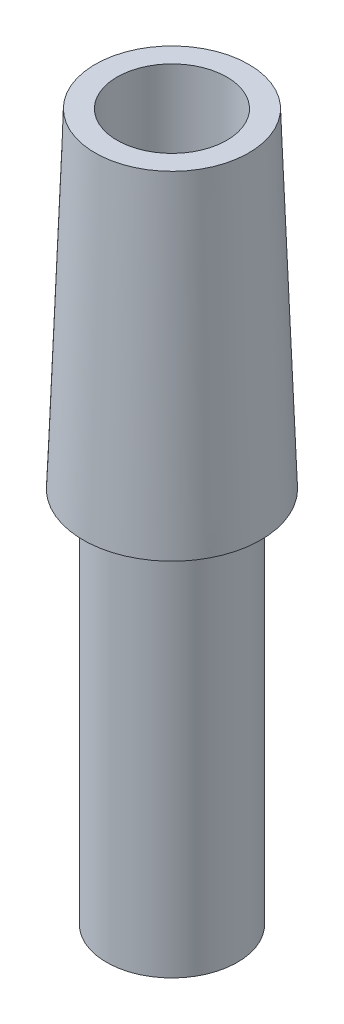
ISO-10303-21;
HEADER;
FILE_DESCRIPTION(('STEP AP214'),'2;1');
FILE_NAME('part.step','',(''),(''),'','','');
FILE_SCHEMA(('AUTOMOTIVE_DESIGN { 1 0 10303 214 1 1 1 1 }'));
ENDSEC;
DATA;
#1=APPLICATION_CONTEXT('core data for automotive mechanical design processes');
#2=APPLICATION_PROTOCOL_DEFINITION('international standard','automotive_design',2000,#1);
#3=PRODUCT_CONTEXT('',#1,'mechanical');
#4=PRODUCT('Part','Part','',(#3));
#5=PRODUCT_RELATED_PRODUCT_CATEGORY('part','',(#4));
#6=PRODUCT_DEFINITION_FORMATION('','',#4);
#7=PRODUCT_DEFINITION_CONTEXT('part definition',#1,'design');
#8=PRODUCT_DEFINITION('design','',#6,#7);
#9=PRODUCT_DEFINITION_SHAPE('','',#8);
#10=(LENGTH_UNIT() NAMED_UNIT(*) SI_UNIT(.MILLI.,.METRE.));
#11=(NAMED_UNIT(*) PLANE_ANGLE_UNIT() SI_UNIT($,.RADIAN.));
#12=(NAMED_UNIT(*) SI_UNIT($,.STERADIAN.) SOLID_ANGLE_UNIT());
#13=UNCERTAINTY_MEASURE_WITH_UNIT(LENGTH_MEASURE(1.E-05),#10,'distance_accuracy_value','');
#14=(GEOMETRIC_REPRESENTATION_CONTEXT(3) GLOBAL_UNCERTAINTY_ASSIGNED_CONTEXT((#13)) GLOBAL_UNIT_ASSIGNED_CONTEXT((#10,
#11,#12)) REPRESENTATION_CONTEXT('',''));
#15=CARTESIAN_POINT('',(0.,0.,0.));
#16=DIRECTION('',(0.,0.,1.));
#17=DIRECTION('',(1.,0.,0.));
#18=AXIS2_PLACEMENT_3D('',#15,#16,#17);
#19=CARTESIAN_POINT('',(2.985,0.,0.));
#20=DIRECTION('',(0.,-1.,0.));
#21=DIRECTION('',(0.,0.,-1.));
#22=AXIS2_PLACEMENT_3D('',#19,#20,#21);
#23=PLANE('',#22);
#24=CARTESIAN_POINT('',(0.,0.,0.));
#25=DIRECTION('',(0.,-1.,0.));
#26=DIRECTION('',(0.,0.,-1.));
#27=AXIS2_PLACEMENT_3D('',#24,#25,#26);
#28=CIRCLE('',#27,2.985);
#29=CARTESIAN_POINT('',(0.,0.,-2.985));
#30=VERTEX_POINT('',#29);
#31=EDGE_CURVE('E59',#30,#30,#28,.T.);
#32=ORIENTED_EDGE('',*,*,#31,.T.);
#33=EDGE_LOOP('',(#32));
#34=FACE_BOUND('',#33,.T.);
#35=CARTESIAN_POINT('',(0.,0.,0.));
#36=DIRECTION('',(0.,-1.,0.));
#37=DIRECTION('',(0.,0.,-1.));
#38=AXIS2_PLACEMENT_3D('',#35,#36,#37);
#39=CIRCLE('',#38,1.485);
#40=CARTESIAN_POINT('',(0.,0.,-1.485));
#41=VERTEX_POINT('',#40);
#42=EDGE_CURVE('E10',#41,#41,#39,.T.);
#43=ORIENTED_EDGE('',*,*,#42,.F.);
#44=EDGE_LOOP('',(#43));
#45=FACE_BOUND('',#44,.T.);
#46=ADVANCED_FACE('F31',(#34,#45),#23,.T.);
#47=CARTESIAN_POINT('',(0.,0.,0.));
#48=DIRECTION('',(0.,-1.,0.));
#49=DIRECTION('',(0.,0.,-1.));
#50=AXIS2_PLACEMENT_3D('',#47,#48,#49);
#51=CYLINDRICAL_SURFACE('',#50,1.485);
#52=ORIENTED_EDGE('',*,*,#42,.T.);
#53=EDGE_LOOP('',(#52));
#54=FACE_BOUND('',#53,.T.);
#55=CARTESIAN_POINT('',(0.,18.8,0.));
#56=DIRECTION('',(0.,-1.,0.));
#57=DIRECTION('',(0.,0.,-1.));
#58=AXIS2_PLACEMENT_3D('',#55,#56,#57);
#59=CIRCLE('',#58,1.485);
#60=CARTESIAN_POINT('',(0.,18.8,-1.485));
#61=VERTEX_POINT('',#60);
#62=EDGE_CURVE('E37',#61,#61,#59,.T.);
#63=ORIENTED_EDGE('',*,*,#62,.F.);
#64=EDGE_LOOP('',(#63));
#65=FACE_BOUND('',#64,.T.);
#66=ADVANCED_FACE('F77',(#54,#65),#51,.F.);
#67=CARTESIAN_POINT('',(1.485,18.8,0.));
#68=DIRECTION('',(0.,1.,0.));
#69=DIRECTION('',(0.,0.,1.));
#70=AXIS2_PLACEMENT_3D('',#67,#68,#69);
#71=PLANE('',#70);
#72=ORIENTED_EDGE('',*,*,#62,.T.);
#73=EDGE_LOOP('',(#72));
#74=FACE_BOUND('',#73,.T.);
#75=CARTESIAN_POINT('',(0.,18.8,0.));
#76=DIRECTION('',(0.,-1.,0.));
#77=DIRECTION('',(0.,0.,-1.));
#78=AXIS2_PLACEMENT_3D('',#75,#76,#77);
#79=CIRCLE('',#78,2.5);
#80=CARTESIAN_POINT('',(0.,18.8,-2.5));
#81=VERTEX_POINT('',#80);
#82=EDGE_CURVE('E41',#81,#81,#79,.T.);
#83=ORIENTED_EDGE('',*,*,#82,.F.);
#84=EDGE_LOOP('',(#83));
#85=FACE_BOUND('',#84,.T.);
#86=ADVANCED_FACE('F81',(#74,#85),#71,.T.);
#87=CARTESIAN_POINT('',(0.,0.,0.));
#88=DIRECTION('',(0.,-1.,0.));
#89=DIRECTION('',(0.,0.,-1.));
#90=AXIS2_PLACEMENT_3D('',#87,#88,#89);
#91=CYLINDRICAL_SURFACE('',#90,2.5);
#92=ORIENTED_EDGE('',*,*,#82,.T.);
#93=EDGE_LOOP('',(#92));
#94=FACE_BOUND('',#93,.T.);
#95=CARTESIAN_POINT('',(0.,32.2,0.));
#96=DIRECTION('',(0.,-1.,0.));
#97=DIRECTION('',(0.,0.,-1.));
#98=AXIS2_PLACEMENT_3D('',#95,#96,#97);
#99=CIRCLE('',#98,2.5);
#100=CARTESIAN_POINT('',(0.,32.2,-2.5));
#101=VERTEX_POINT('',#100);
#102=EDGE_CURVE('E45',#101,#101,#99,.T.);
#103=ORIENTED_EDGE('',*,*,#102,.F.);
#104=EDGE_LOOP('',(#103));
#105=FACE_BOUND('',#104,.T.);
#106=ADVANCED_FACE('F85',(#94,#105),#91,.F.);
#107=CARTESIAN_POINT('',(2.5,32.2,0.));
#108=DIRECTION('',(0.,1.,0.));
#109=DIRECTION('',(0.,0.,1.));
#110=AXIS2_PLACEMENT_3D('',#107,#108,#109);
#111=PLANE('',#110);
#112=ORIENTED_EDGE('',*,*,#102,.T.);
#113=EDGE_LOOP('',(#112));
#114=FACE_BOUND('',#113,.T.);
#115=CARTESIAN_POINT('',(0.,32.2,0.));
#116=DIRECTION('',(0.,-1.,0.));
#117=DIRECTION('',(0.,0.,-1.));
#118=AXIS2_PLACEMENT_3D('',#115,#116,#117);
#119=CIRCLE('',#118,3.5);
#120=CARTESIAN_POINT('',(0.,32.2,-3.5));
#121=VERTEX_POINT('',#120);
#122=EDGE_CURVE('E50',#121,#121,#119,.T.);
#123=ORIENTED_EDGE('',*,*,#122,.F.);
#124=EDGE_LOOP('',(#123));
#125=FACE_BOUND('',#124,.T.);
#126=ADVANCED_FACE('F91',(#114,#125),#111,.T.);
#127=CARTESIAN_POINT('',(0.,17.2,0.));
#128=DIRECTION('',(0.,-1.,0.));
#129=DIRECTION('',(0.,0.,-1.));
#130=AXIS2_PLACEMENT_3D('',#127,#128,#129);
#131=CONICAL_SURFACE('',#130,4.05,0.0366502478104116);
#132=ORIENTED_EDGE('',*,*,#122,.T.);
#133=EDGE_LOOP('',(#132));
#134=FACE_BOUND('',#133,.T.);
#135=CARTESIAN_POINT('',(0.,17.2,0.));
#136=DIRECTION('',(0.,-1.,0.));
#137=DIRECTION('',(0.,0.,-1.));
#138=AXIS2_PLACEMENT_3D('',#135,#136,#137);
#139=CIRCLE('',#138,4.05);
#140=CARTESIAN_POINT('',(0.,17.2,-4.05));
#141=VERTEX_POINT('',#140);
#142=EDGE_CURVE('E53',#141,#141,#139,.T.);
#143=ORIENTED_EDGE('',*,*,#142,.F.);
#144=EDGE_LOOP('',(#143));
#145=FACE_BOUND('',#144,.T.);
#146=ADVANCED_FACE('F73',(#134,#145),#131,.T.);
#147=CARTESIAN_POINT('',(4.05,17.2,0.));
#148=DIRECTION('',(0.,-1.,0.));
#149=DIRECTION('',(0.,0.,-1.));
#150=AXIS2_PLACEMENT_3D('',#147,#148,#149);
#151=PLANE('',#150);
#152=ORIENTED_EDGE('',*,*,#142,.T.);
#153=EDGE_LOOP('',(#152));
#154=FACE_BOUND('',#153,.T.);
#155=CARTESIAN_POINT('',(0.,17.2,0.));
#156=DIRECTION('',(0.,-1.,0.));
#157=DIRECTION('',(0.,0.,-1.));
#158=AXIS2_PLACEMENT_3D('',#155,#156,#157);
#159=CIRCLE('',#158,2.985);
#160=CARTESIAN_POINT('',(0.,17.2,-2.985));
#161=VERTEX_POINT('',#160);
#162=EDGE_CURVE('E56',#161,#161,#159,.T.);
#163=ORIENTED_EDGE('',*,*,#162,.F.);
#164=EDGE_LOOP('',(#163));
#165=FACE_BOUND('',#164,.T.);
#166=ADVANCED_FACE('F67',(#154,#165),#151,.T.);
#167=CARTESIAN_POINT('',(0.,0.,0.));
#168=DIRECTION('',(0.,-1.,0.));
#169=DIRECTION('',(0.,0.,-1.));
#170=AXIS2_PLACEMENT_3D('',#167,#168,#169);
#171=CYLINDRICAL_SURFACE('',#170,2.985);
#172=ORIENTED_EDGE('',*,*,#162,.T.);
#173=EDGE_LOOP('',(#172));
#174=FACE_BOUND('',#173,.T.);
#175=ORIENTED_EDGE('',*,*,#31,.F.);
#176=EDGE_LOOP('',(#175));
#177=FACE_BOUND('',#176,.T.);
#178=ADVANCED_FACE('F65',(#174,#177),#171,.T.);
#179=CLOSED_SHELL('',(#46,#66,#86,#106,#126,#146,#166,#178));
#180=MANIFOLD_SOLID_BREP('B2',#179);
#181=ADVANCED_BREP_SHAPE_REPRESENTATION('',(#18,#180),#14);
#182=SHAPE_DEFINITION_REPRESENTATION(#9,#181);
ENDSEC;
END-ISO-10303-21;
